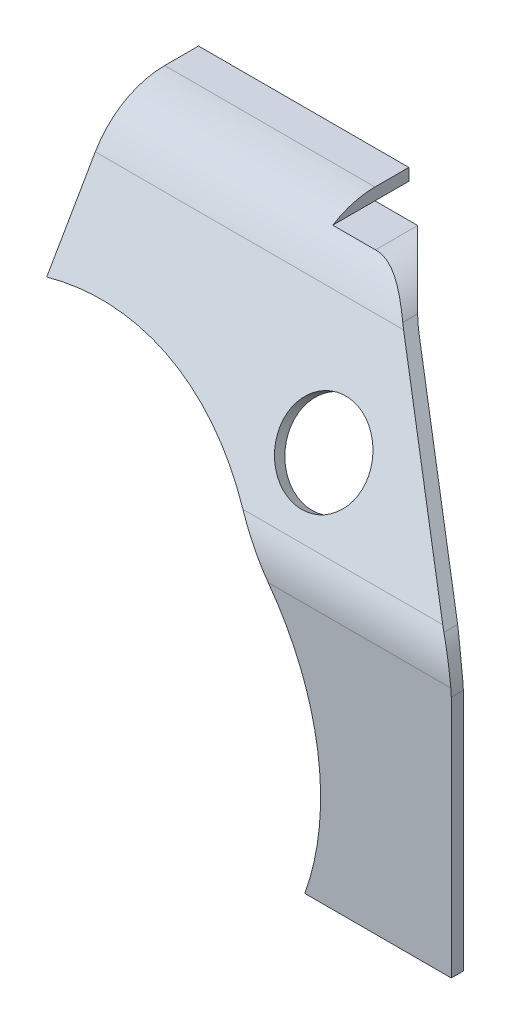
ISO-10303-21;
HEADER;
FILE_DESCRIPTION(('STEP AP214'),'2;1');
FILE_NAME('part.step','',(''),(''),'','','');
FILE_SCHEMA(('AUTOMOTIVE_DESIGN { 1 0 10303 214 1 1 1 1 }'));
ENDSEC;
DATA;
#1=APPLICATION_CONTEXT('core data for automotive mechanical design processes');
#2=APPLICATION_PROTOCOL_DEFINITION('international standard','automotive_design',2000,#1);
#3=PRODUCT_CONTEXT('',#1,'mechanical');
#4=PRODUCT('Part','Part','',(#3));
#5=PRODUCT_RELATED_PRODUCT_CATEGORY('part','',(#4));
#6=PRODUCT_DEFINITION_FORMATION('','',#4);
#7=PRODUCT_DEFINITION_CONTEXT('part definition',#1,'design');
#8=PRODUCT_DEFINITION('design','',#6,#7);
#9=PRODUCT_DEFINITION_SHAPE('','',#8);
#10=(LENGTH_UNIT() NAMED_UNIT(*) SI_UNIT(.MILLI.,.METRE.));
#11=(NAMED_UNIT(*) PLANE_ANGLE_UNIT() SI_UNIT($,.RADIAN.));
#12=(NAMED_UNIT(*) SI_UNIT($,.STERADIAN.) SOLID_ANGLE_UNIT());
#13=UNCERTAINTY_MEASURE_WITH_UNIT(LENGTH_MEASURE(1.E-05),#10,'distance_accuracy_value','');
#14=(GEOMETRIC_REPRESENTATION_CONTEXT(3) GLOBAL_UNCERTAINTY_ASSIGNED_CONTEXT((#13)) GLOBAL_UNIT_ASSIGNED_CONTEXT((#10,
#11,#12)) REPRESENTATION_CONTEXT('',''));
#15=CARTESIAN_POINT('',(0.,0.,0.));
#16=DIRECTION('',(0.,0.,1.));
#17=DIRECTION('',(1.,0.,0.));
#18=AXIS2_PLACEMENT_3D('',#15,#16,#17);
#19=CARTESIAN_POINT('',(58.05,68.,3.));
#20=DIRECTION('',(0.,0.,-1.));
#21=DIRECTION('',(0.,1.,0.));
#22=AXIS2_PLACEMENT_3D('',#19,#20,#21);
#23=PLANE('',#22);
#24=CARTESIAN_POINT('',(-45.0719206905526,22.7215242270665,2.99999999999999));
#25=DIRECTION('',(0.,0.,1.));
#26=DIRECTION('',(1.,0.,0.));
#27=AXIS2_PLACEMENT_3D('',#24,#25,#26);
#28=CIRCLE('',#27,67.5);
#29=CARTESIAN_POINT('',(18.4889346907183,0.,2.99999999999999));
#30=VERTEX_POINT('',#29);
#31=CARTESIAN_POINT('',(9.35862371702119,62.6410161513776,2.99999999999999));
#32=VERTEX_POINT('',#31);
#33=EDGE_CURVE('E169',#30,#32,#28,.T.);
#34=ORIENTED_EDGE('',*,*,#33,.F.);
#35=DIRECTION('',(-1.,0.,0.));
#36=VECTOR('',#35,1.);
#37=CARTESIAN_POINT('',(58.05,0.,2.99999999999999));
#38=LINE('',#37,#36);
#39=CARTESIAN_POINT('',(55.050895814341,4.6493348638715E-13,2.99999999999999));
#40=VERTEX_POINT('',#39);
#41=EDGE_CURVE('E213',#40,#30,#38,.T.);
#42=ORIENTED_EDGE('',*,*,#41,.F.);
#43=DIRECTION('',(0.,1.,0.));
#44=VECTOR('',#43,1.);
#45=CARTESIAN_POINT('',(55.050895814341,4.6493348638715E-13,2.99999999999999));
#46=LINE('',#45,#44);
#47=CARTESIAN_POINT('',(55.0508958143407,60.7205953146764,2.99999999999993));
#48=VERTEX_POINT('',#47);
#49=EDGE_CURVE('E422',#40,#48,#46,.T.);
#50=ORIENTED_EDGE('',*,*,#49,.T.);
#51=CARTESIAN_POINT('',(38.0508958143407,60.7205953146763,2.99999999999993));
#52=DIRECTION('',(0.,0.,-1.));
#53=DIRECTION('',(-1.,0.,0.));
#54=AXIS2_PLACEMENT_3D('',#51,#52,#53);
#55=CIRCLE('',#54,17.);
#56=CARTESIAN_POINT('',(54.9420764660881,62.6410161513776,2.99999999999993));
#57=VERTEX_POINT('',#56);
#58=EDGE_CURVE('E194',#57,#48,#55,.T.);
#59=ORIENTED_EDGE('',*,*,#58,.F.);
#60=DIRECTION('',(-1.,0.,0.));
#61=VECTOR('',#60,1.);
#62=CARTESIAN_POINT('',(58.05,62.6410161513776,3.));
#63=LINE('',#62,#61);
#64=EDGE_CURVE('E187',#57,#32,#63,.T.);
#65=ORIENTED_EDGE('',*,*,#64,.T.);
#66=EDGE_LOOP('',(#34,#42,#50,#59,#65));
#67=FACE_BOUND('',#66,.T.);
#68=ADVANCED_FACE('F46',(#67),#23,.F.);
#69=CARTESIAN_POINT('',(-58.05,0.,0.));
#70=DIRECTION('',(1.,0.,0.));
#71=DIRECTION('',(0.,0.,-1.));
#72=AXIS2_PLACEMENT_3D('',#69,#70,#71);
#73=PLANE('',#72);
#74=DIRECTION('',(0.,0.86602540378444,-0.499999999999998));
#75=VECTOR('',#74,1.);
#76=CARTESIAN_POINT('',(-58.05,67.1961524227066,0.));
#77=LINE('',#76,#75);
#78=CARTESIAN_POINT('',(-58.05,88.962142109433,-12.56660000481));
#79=VERTEX_POINT('',#78);
#80=CARTESIAN_POINT('',(-58.05,108.461524227066,-23.8245735194569));
#81=VERTEX_POINT('',#80);
#82=EDGE_CURVE('E333',#79,#81,#77,.T.);
#83=ORIENTED_EDGE('',*,*,#82,.F.);
#84=DIRECTION('',(0.,0.,1.));
#85=VECTOR('',#84,1.);
#86=CARTESIAN_POINT('',(-58.05,88.962142109433,-46.9999999999999));
#87=LINE('',#86,#85);
#88=CARTESIAN_POINT('',(-58.05,88.962142109433,-9.10249838967224));
#89=VERTEX_POINT('',#88);
#90=EDGE_CURVE('E319',#79,#89,#87,.T.);
#91=ORIENTED_EDGE('',*,*,#90,.T.);
#92=DIRECTION('',(0.,-0.86602540378444,0.499999999999998));
#93=VECTOR('',#92,1.);
#94=CARTESIAN_POINT('',(-58.05,119.961524227066,-26.9999999999999));
#95=LINE('',#94,#93);
#96=CARTESIAN_POINT('',(-58.05,109.961524227066,-21.2264973081036));
#97=VERTEX_POINT('',#96);
#98=EDGE_CURVE('E327',#97,#89,#95,.T.);
#99=ORIENTED_EDGE('',*,*,#98,.F.);
#100=CARTESIAN_POINT('',(-58.05,99.9615242270664,-38.5470053837924));
#101=DIRECTION('',(1.,0.,0.));
#102=DIRECTION('',(0.,0.,-1.));
#103=AXIS2_PLACEMENT_3D('',#100,#101,#102);
#104=CIRCLE('',#103,20.);
#105=CARTESIAN_POINT('',(-58.05,119.961524227066,-38.5470053837924));
#106=VERTEX_POINT('',#105);
#107=EDGE_CURVE('E371',#97,#106,#104,.F.);
#108=ORIENTED_EDGE('',*,*,#107,.T.);
#109=DIRECTION('',(0.,0.,1.));
#110=VECTOR('',#109,1.);
#111=CARTESIAN_POINT('',(-58.05,119.961524227066,-46.9999999999999));
#112=LINE('',#111,#110);
#113=CARTESIAN_POINT('',(-58.05,119.961524227066,-46.9999999999999));
#114=VERTEX_POINT('',#113);
#115=EDGE_CURVE('E356',#114,#106,#112,.T.);
#116=ORIENTED_EDGE('',*,*,#115,.F.);
#117=DIRECTION('',(0.,1.,0.));
#118=VECTOR('',#117,1.);
#119=CARTESIAN_POINT('',(-58.05,116.961524227066,-46.9999999999999));
#120=LINE('',#119,#118);
#121=CARTESIAN_POINT('',(-58.05,116.961524227066,-46.9999999999999));
#122=VERTEX_POINT('',#121);
#123=EDGE_CURVE('E347',#122,#114,#120,.T.);
#124=ORIENTED_EDGE('',*,*,#123,.F.);
#125=DIRECTION('',(0.,0.,-1.));
#126=VECTOR('',#125,1.);
#127=CARTESIAN_POINT('',(-58.05,116.961524227066,-28.7320508075687));
#128=LINE('',#127,#126);
#129=CARTESIAN_POINT('',(-58.05,116.961524227066,-38.5470053837924));
#130=VERTEX_POINT('',#129);
#131=EDGE_CURVE('E341',#130,#122,#128,.T.);
#132=ORIENTED_EDGE('',*,*,#131,.F.);
#133=CARTESIAN_POINT('',(-58.05,99.9615242270664,-38.5470053837924));
#134=DIRECTION('',(1.,0.,0.));
#135=DIRECTION('',(0.,0.,-1.));
#136=AXIS2_PLACEMENT_3D('',#133,#134,#135);
#137=CIRCLE('',#136,17.);
#138=EDGE_CURVE('E338',#130,#81,#137,.T.);
#139=ORIENTED_EDGE('',*,*,#138,.T.);
#140=EDGE_LOOP('',(#83,#91,#99,#108,#116,#124,#132,#139));
#141=FACE_BOUND('',#140,.T.);
#142=ADVANCED_FACE('F258',(#141),#73,.F.);
#143=CARTESIAN_POINT('',(58.05,99.9615242270664,-38.5470053837924));
#144=DIRECTION('',(1.,0.,0.));
#145=DIRECTION('',(0.,0.,-1.));
#146=AXIS2_PLACEMENT_3D('',#143,#144,#145);
#147=CYLINDRICAL_SURFACE('',#146,17.);
#148=CARTESIAN_POINT('',(27.3157707555489,99.9615242270664,-38.5470053837924));
#149=DIRECTION('',(0.766044443118976,0.642787609686541,0.));
#150=DIRECTION('',(0.642787609686542,-0.766044443118976,0.));
#151=AXIS2_PLACEMENT_3D('',#148,#149,#150);
#152=ELLIPSE('',#151,22.1919239186488,17.);
#153=CARTESIAN_POINT('',(20.183423890542,108.461524227066,-23.8245735194569));
#154=VERTEX_POINT('',#153);
#155=CARTESIAN_POINT('',(18.1466023699226,110.888913591738,-25.5242498507698));
#156=VERTEX_POINT('',#155);
#157=EDGE_CURVE('E209',#154,#156,#152,.F.);
#158=ORIENTED_EDGE('',*,*,#157,.F.);
#159=DIRECTION('',(-1.,0.,0.));
#160=VECTOR('',#159,1.);
#161=CARTESIAN_POINT('',(58.05,108.461524227066,-23.8245735194569));
#162=LINE('',#161,#160);
#163=EDGE_CURVE('E385',#81,#154,#162,.F.);
#164=ORIENTED_EDGE('',*,*,#163,.F.);
#165=ORIENTED_EDGE('',*,*,#138,.F.);
#166=DIRECTION('',(-1.,0.,0.));
#167=VECTOR('',#166,1.);
#168=CARTESIAN_POINT('',(-58.05,116.961524227066,-38.5470053837924));
#169=LINE('',#168,#167);
#170=CARTESIAN_POINT('',(-5.55000000000004,116.961524227067,-38.5470053837925));
#171=VERTEX_POINT('',#170);
#172=EDGE_CURVE('E377',#171,#130,#169,.T.);
#173=ORIENTED_EDGE('',*,*,#172,.F.);
#174=CARTESIAN_POINT('',(5.12384683689994,116.961524227067,-38.5470053837924));
#175=VERTEX_POINT('',#174);
#176=EDGE_CURVE('E382',#175,#171,#169,.T.);
#177=ORIENTED_EDGE('',*,*,#176,.F.);
#178=CARTESIAN_POINT('',(5.12384683690001,99.9615242270665,-38.5470053837924));
#179=DIRECTION('',(0.707106781186548,0.,-0.707106781186547));
#180=DIRECTION('',(0.707106781186548,0.,0.707106781186547));
#181=AXIS2_PLACEMENT_3D('',#178,#179,#180);
#182=ELLIPSE('',#181,24.0416305603426,17.);
#183=EDGE_CURVE('E230',#156,#175,#182,.F.);
#184=ORIENTED_EDGE('',*,*,#183,.F.);
#185=EDGE_LOOP('',(#158,#164,#165,#173,#177,#184));
#186=FACE_BOUND('',#185,.T.);
#187=ADVANCED_FACE('F411',(#186),#147,.F.);
#188=CARTESIAN_POINT('',(58.05,62.6410161513776,-17.));
#189=DIRECTION('',(1.,0.,0.));
#190=DIRECTION('',(0.,0.,-1.));
#191=AXIS2_PLACEMENT_3D('',#188,#189,#190);
#192=CYLINDRICAL_SURFACE('',#191,17.);
#193=DIRECTION('',(-1.,0.,0.));
#194=VECTOR('',#193,1.);
#195=CARTESIAN_POINT('',(58.05,62.6410161513776,0.));
#196=LINE('',#195,#194);
#197=CARTESIAN_POINT('',(9.35862371702118,62.6410161513776,0.));
#198=VERTEX_POINT('',#197);
#199=CARTESIAN_POINT('',(54.9420764660881,62.6410161513776,0.));
#200=VERTEX_POINT('',#199);
#201=EDGE_CURVE('E51',#198,#200,#196,.F.);
#202=ORIENTED_EDGE('',*,*,#201,.F.);
#203=CARTESIAN_POINT('',(9.35862371702118,62.6410161513776,0.));
#204=CARTESIAN_POINT('',(9.14366444772332,62.9341211886953,-5.1426327152452E-06));
#205=CARTESIAN_POINT('',(8.92636797796525,63.2254345498958,-0.00758021528181495));
#206=CARTESIAN_POINT('',(8.4874977596297,63.8040076190606,-0.0373530236044078));
#207=CARTESIAN_POINT('',(8.26592458599367,64.0912678630434,-0.0595488068419231));
#208=CARTESIAN_POINT('',(7.59556501501332,64.9460404950894,-0.147259891062621));
#209=CARTESIAN_POINT('',(7.1408813778368,65.506895296019,-0.233900173430174));
#210=CARTESIAN_POINT('',(6.22625738618625,66.5991619498439,-0.457951427369915));
#211=CARTESIAN_POINT('',(5.76649764752407,67.1308888942026,-0.594582867108043));
#212=CARTESIAN_POINT('',(4.83823721746269,68.1716297591137,-0.915574821227867));
#213=CARTESIAN_POINT('',(4.36973847381397,68.6806486570504,-1.09992481530274));
#214=CARTESIAN_POINT('',(3.57780609212094,69.5154473088458,-1.4476268825233));
#215=CARTESIAN_POINT('',(3.25587725848414,69.8477848327219,-1.59885133676382));
#216=CARTESIAN_POINT('',(2.60871143359641,70.5024886542673,-1.92249861588798));
#217=CARTESIAN_POINT('',(2.28346594497334,70.824794084813,-2.09502762753208));
#218=CARTESIAN_POINT('',(1.95788689773735,71.1410161513775,-2.27756813566452));
#219=B_SPLINE_CURVE_WITH_KNOTS('',3,(#203,#204,#205,#206,#207,#208,#209,#210,#211,#212,#213,
#214,#215,#216,#217,#218),.UNSPECIFIED.,.F.,.F.,(4,2,2,2,2,2,2,4),(0.,1.09023800501283,
2.18033045017189,4.35921538197208,6.50547920317344,8.65127024913212,10.111083053848,
11.578490183521),.UNSPECIFIED.);
#220=CARTESIAN_POINT('',(1.95788689773736,71.1410161513775,-2.27756813566452));
#221=VERTEX_POINT('',#220);
#222=EDGE_CURVE('E306',#198,#221,#219,.T.);
#223=ORIENTED_EDGE('',*,*,#222,.T.);
#224=DIRECTION('',(-1.,0.,0.));
#225=VECTOR('',#224,1.);
#226=CARTESIAN_POINT('',(-58.05,71.1410161513775,-2.27756813566452));
#227=LINE('',#226,#225);
#228=CARTESIAN_POINT('',(51.48275456829,71.1410161513775,-2.27756813566452));
#229=VERTEX_POINT('',#228);
#230=EDGE_CURVE('E214',#229,#221,#227,.T.);
#231=ORIENTED_EDGE('',*,*,#230,.F.);
#232=CARTESIAN_POINT('',(54.9420764660881,62.6410161513776,0.));
#233=CARTESIAN_POINT('',(54.919334039781,62.8410778656383,3.2817420601101E-06));
#234=CARTESIAN_POINT('',(54.8930337510738,63.0406983104257,-0.00353262128909872));
#235=CARTESIAN_POINT('',(54.8334099589753,63.4386241561322,-0.0175548554111924));
#236=CARTESIAN_POINT('',(54.8000870973747,63.636929675515,-0.0280405515504063));
#237=CARTESIAN_POINT('',(54.6898120040309,64.2287656530385,-0.0696952404371726));
#238=CARTESIAN_POINT('',(54.6024935376012,64.6197387489288,-0.111062512932444));
#239=CARTESIAN_POINT('',(54.4043904150723,65.3803662258865,-0.217883145646493));
#240=CARTESIAN_POINT('',(54.2943273265755,65.7503110806001,-0.282633335977358));
#241=CARTESIAN_POINT('',(54.0509536470642,66.477788043186,-0.434455797684508));
#242=CARTESIAN_POINT('',(53.9176400979125,66.8353185646439,-0.521530910106089));
#243=CARTESIAN_POINT('',(53.6259381803424,67.5447338879187,-0.71833913042674));
#244=CARTESIAN_POINT('',(53.4670023830039,67.8962491097505,-0.828588125593772));
#245=CARTESIAN_POINT('',(53.1285324397764,68.5826150776642,-1.06797038015978));
#246=CARTESIAN_POINT('',(52.9489921310169,68.9174607946847,-1.19710929277729));
#247=CARTESIAN_POINT('',(52.5656308145079,69.5790950473408,-1.47596172577744));
#248=CARTESIAN_POINT('',(52.3612441010256,69.9053428539206,-1.62617518769987));
#249=CARTESIAN_POINT('',(51.9348056802218,70.5380531029711,-1.9413906006558));
#250=CARTESIAN_POINT('',(51.7127719837323,70.8445351542651,-2.10637749489704));
#251=CARTESIAN_POINT('',(51.48275456829,71.1410161513775,-2.27756813566452));
#252=B_SPLINE_CURVE_WITH_KNOTS('',3,(#232,#233,#234,#235,#236,#237,#238,#239,#240,#241,#242,
#243,#244,#245,#246,#247,#248,#249,#250,#251),.UNSPECIFIED.,.F.,.F.,(4,2,2,2,2,2,2,2,2,4),(0.,
0.603917425499734,1.20777968308954,2.41393127787172,3.58647843572826,4.75917488478916,
5.96143624875911,7.16405815452329,8.40265831934522,9.64001019115751),.UNSPECIFIED.);
#253=EDGE_CURVE('E232',#200,#229,#252,.T.);
#254=ORIENTED_EDGE('',*,*,#253,.F.);
#255=EDGE_LOOP('',(#202,#223,#231,#254));
#256=FACE_BOUND('',#255,.T.);
#257=ADVANCED_FACE('F48',(#256),#192,.F.);
#258=CARTESIAN_POINT('',(58.05,67.1961524227066,0.));
#259=DIRECTION('',(0.,0.499999999999998,0.86602540378444));
#260=DIRECTION('',(0.,-0.86602540378444,0.499999999999998));
#261=AXIS2_PLACEMENT_3D('',#258,#259,#260);
#262=PLANE('',#261);
#263=CARTESIAN_POINT('',(12.3508958143472,85.3015401945494,-10.4531505038559));
#264=DIRECTION('',(0.,0.499999999999998,0.86602540378444));
#265=DIRECTION('',(0.,-0.86602540378444,0.499999999999998));
#266=AXIS2_PLACEMENT_3D('',#263,#264,#265);
#267=CIRCLE('',#266,11.);
#268=CARTESIAN_POINT('',(12.3508958143472,75.7752607529205,-4.95315050385592));
#269=VERTEX_POINT('',#268);
#270=EDGE_CURVE('E177',#269,#269,#267,.T.);
#271=ORIENTED_EDGE('',*,*,#270,.T.);
#272=EDGE_LOOP('',(#271));
#273=FACE_BOUND('',#272,.T.);
#274=ORIENTED_EDGE('',*,*,#230,.T.);
#275=CARTESIAN_POINT('',(-45.0719206905526,22.7215242270665,25.6774385608612));
#276=DIRECTION('',(0.,0.499999999999998,0.86602540378444));
#277=DIRECTION('',(0.,-0.86602540378444,0.499999999999998));
#278=AXIS2_PLACEMENT_3D('',#275,#276,#277);
#279=ELLIPSE('',#278,77.9422863405994,67.5);
#280=EDGE_CURVE('E314',#221,#79,#279,.T.);
#281=ORIENTED_EDGE('',*,*,#280,.T.);
#282=ORIENTED_EDGE('',*,*,#82,.T.);
#283=ORIENTED_EDGE('',*,*,#163,.T.);
#284=DIRECTION('',(-0.587858883152558,0.700582935935476,-0.404481746652003));
#285=VECTOR('',#284,1.);
#286=CARTESIAN_POINT('',(55.9291377177779,65.8614413536138,0.770595795031102));
#287=LINE('',#286,#285);
#288=CARTESIAN_POINT('',(51.0736513473633,71.6479846793475,-2.5702665517587));
#289=VERTEX_POINT('',#288);
#290=EDGE_CURVE('E613',#289,#154,#287,.T.);
#291=ORIENTED_EDGE('',*,*,#290,.F.);
#292=CARTESIAN_POINT('',(38.0508958143407,60.7205953146763,3.73866463947403));
#293=DIRECTION('',(0.,0.499999999999998,0.86602540378444));
#294=DIRECTION('',(0.,0.86602540378444,-0.499999999999998));
#295=AXIS2_PLACEMENT_3D('',#292,#293,#294);
#296=ELLIPSE('',#295,19.6299091524472,17.);
#297=EDGE_CURVE('E445',#229,#289,#296,.T.);
#298=ORIENTED_EDGE('',*,*,#297,.F.);
#299=EDGE_LOOP('',(#274,#281,#282,#283,#291,#298));
#300=FACE_BOUND('',#299,.T.);
#301=ADVANCED_FACE('F335',(#273,#300),#262,.F.);
#302=CARTESIAN_POINT('',(58.05,0.,0.));
#303=DIRECTION('',(0.,0.,1.));
#304=DIRECTION('',(1.,0.,0.));
#305=AXIS2_PLACEMENT_3D('',#302,#303,#304);
#306=PLANE('',#305);
#307=DIRECTION('',(-1.,0.,0.));
#308=VECTOR('',#307,1.);
#309=CARTESIAN_POINT('',(58.05,0.,0.));
#310=LINE('',#309,#308);
#311=CARTESIAN_POINT('',(55.050895814341,4.62041946253422E-13,0.));
#312=VERTEX_POINT('',#311);
#313=CARTESIAN_POINT('',(18.4889346907183,0.,0.));
#314=VERTEX_POINT('',#313);
#315=EDGE_CURVE('E200',#312,#314,#310,.T.);
#316=ORIENTED_EDGE('',*,*,#315,.T.);
#317=CARTESIAN_POINT('',(-45.0719206905526,22.7215242270665,0.));
#318=DIRECTION('',(0.,0.,1.));
#319=DIRECTION('',(1.,0.,0.));
#320=AXIS2_PLACEMENT_3D('',#317,#318,#319);
#321=CIRCLE('',#320,67.5);
#322=EDGE_CURVE('E64',#314,#198,#321,.T.);
#323=ORIENTED_EDGE('',*,*,#322,.T.);
#324=ORIENTED_EDGE('',*,*,#201,.T.);
#325=CARTESIAN_POINT('',(38.0508958143407,60.7205953146763,0.));
#326=DIRECTION('',(0.,0.,1.));
#327=DIRECTION('',(1.,0.,0.));
#328=AXIS2_PLACEMENT_3D('',#325,#326,#327);
#329=CIRCLE('',#328,17.);
#330=CARTESIAN_POINT('',(55.0508958143407,60.7205953146764,0.));
#331=VERTEX_POINT('',#330);
#332=EDGE_CURVE('E269',#331,#200,#329,.T.);
#333=ORIENTED_EDGE('',*,*,#332,.F.);
#334=DIRECTION('',(0.,1.,0.));
#335=VECTOR('',#334,1.);
#336=CARTESIAN_POINT('',(55.050895814341,0.,0.));
#337=LINE('',#336,#335);
#338=EDGE_CURVE('E59',#312,#331,#337,.T.);
#339=ORIENTED_EDGE('',*,*,#338,.F.);
#340=EDGE_LOOP('',(#316,#323,#324,#333,#339));
#341=FACE_BOUND('',#340,.T.);
#342=ADVANCED_FACE('F449',(#341),#306,.F.);
#343=CARTESIAN_POINT('',(58.05,99.9615242270664,-38.5470053837924));
#344=DIRECTION('',(-1.,0.,0.));
#345=DIRECTION('',(0.,0.,1.));
#346=AXIS2_PLACEMENT_3D('',#343,#344,#345);
#347=CYLINDRICAL_SURFACE('',#346,20.);
#348=DIRECTION('',(-1.,0.,0.));
#349=VECTOR('',#348,1.);
#350=CARTESIAN_POINT('',(58.0499999999999,116.961524227067,-28.0113516309404));
#351=LINE('',#350,#349);
#352=CARTESIAN_POINT('',(5.12384683689994,116.961524227067,-28.01135163094));
#353=VERTEX_POINT('',#352);
#354=CARTESIAN_POINT('',(-5.55000000000004,116.961524227067,-28.0113516309404));
#355=VERTEX_POINT('',#354);
#356=EDGE_CURVE('E611',#353,#355,#351,.T.);
#357=ORIENTED_EDGE('',*,*,#356,.T.);
#358=CARTESIAN_POINT('',(-5.55000000000001,99.9615242270664,-38.5470053837924));
#359=DIRECTION('',(1.,0.,0.));
#360=DIRECTION('',(0.,1.,0.));
#361=AXIS2_PLACEMENT_3D('',#358,#359,#360);
#362=CIRCLE('',#361,20.);
#363=CARTESIAN_POINT('',(-5.55000000000005,119.961524227067,-38.5470053837925));
#364=VERTEX_POINT('',#363);
#365=EDGE_CURVE('E351',#355,#364,#362,.F.);
#366=ORIENTED_EDGE('',*,*,#365,.T.);
#367=DIRECTION('',(-1.,0.,0.));
#368=VECTOR('',#367,1.);
#369=CARTESIAN_POINT('',(58.05,119.961524227066,-38.5470053837924));
#370=LINE('',#369,#368);
#371=EDGE_CURVE('E372',#106,#364,#370,.F.);
#372=ORIENTED_EDGE('',*,*,#371,.F.);
#373=ORIENTED_EDGE('',*,*,#107,.F.);
#374=DIRECTION('',(-1.,0.,0.));
#375=VECTOR('',#374,1.);
#376=CARTESIAN_POINT('',(58.05,109.961524227066,-21.2264973081036));
#377=LINE('',#376,#375);
#378=CARTESIAN_POINT('',(18.9247744437761,109.961524227066,-21.2264973081036));
#379=VERTEX_POINT('',#378);
#380=EDGE_CURVE('E201',#379,#97,#377,.T.);
#381=ORIENTED_EDGE('',*,*,#380,.F.);
#382=CARTESIAN_POINT('',(27.3157707555489,99.9615242270664,-38.5470053837924));
#383=DIRECTION('',(0.766044443118976,0.642787609686541,0.));
#384=DIRECTION('',(-0.642787609686542,0.766044443118976,0.));
#385=AXIS2_PLACEMENT_3D('',#382,#383,#384);
#386=ELLIPSE('',#385,26.1081457866456,20.);
#387=CARTESIAN_POINT('',(18.1466023699226,110.888913591738,-21.7961199841227));
#388=VERTEX_POINT('',#387);
#389=EDGE_CURVE('E617',#379,#388,#386,.F.);
#390=ORIENTED_EDGE('',*,*,#389,.T.);
#391=CARTESIAN_POINT('',(18.1466023699226,110.888913591738,-21.7961199841227));
#392=CARTESIAN_POINT('',(17.9736740642455,111.094989527595,-21.9305500909028));
#393=CARTESIAN_POINT('',(17.7965874966077,111.296110651878,-22.0671746936423));
#394=CARTESIAN_POINT('',(17.4344589132233,111.688422707842,-22.3439978561944));
#395=CARTESIAN_POINT('',(17.2494181046327,111.879615136669,-22.4841958723911));
#396=CARTESIAN_POINT('',(16.8716588829598,112.252141856973,-22.7674150036981));
#397=CARTESIAN_POINT('',(16.6789392257137,112.433474539579,-22.9104365743847));
#398=CARTESIAN_POINT('',(16.2860899428549,112.786266742225,-23.1984595091002));
#399=CARTESIAN_POINT('',(16.0859598972168,112.957725701205,-23.3434609850565));
#400=CARTESIAN_POINT('',(15.4704888322729,113.460779957492,-23.7832085316473));
#401=CARTESIAN_POINT('',(15.0439346303349,113.77724324659,-24.0797689519091));
#402=CARTESIAN_POINT('',(14.1618324377933,114.369756970441,-24.6697794463797));
#403=CARTESIAN_POINT('',(13.7062931089616,114.645819397763,-24.9632304195052));
#404=CARTESIAN_POINT('',(12.9220975371303,115.071604165281,-25.4416159918227));
#405=CARTESIAN_POINT('',(12.6017819408408,115.232759890446,-25.6301074294754));
#406=CARTESIAN_POINT('',(11.947188763367,115.536252243159,-25.9977193918585));
#407=CARTESIAN_POINT('',(11.6129144336623,115.678593221501,-26.1768420772443));
#408=CARTESIAN_POINT('',(10.9305439493834,115.943259169989,-26.5207380242421));
#409=CARTESIAN_POINT('',(10.5824860598767,116.065635304538,-26.6855474426583));
#410=CARTESIAN_POINT('',(9.87122832346907,116.289451959786,-26.9955852725739));
#411=CARTESIAN_POINT('',(9.5080349945082,116.390901382654,-27.1408220010907));
#412=CARTESIAN_POINT('',(8.87438224344016,116.544850276085,-27.366388601932));
#413=CARTESIAN_POINT('',(8.6076451995288,116.603007384816,-27.4533154409466));
#414=CARTESIAN_POINT('',(8.06712741172895,116.707054358501,-27.6110030083618));
#415=CARTESIAN_POINT('',(7.79334937825444,116.752948868665,-27.6817698568698));
#416=CARTESIAN_POINT('',(7.24057304704835,116.831531746706,-27.8041872092607));
#417=CARTESIAN_POINT('',(6.96159398248098,116.864261393824,-27.8558974229831));
#418=CARTESIAN_POINT('',(6.39936340454048,116.915951578616,-27.938056755063));
#419=CARTESIAN_POINT('',(6.11611513863519,116.934922091385,-27.9685212755008));
#420=CARTESIAN_POINT('',(5.71414030469924,116.951682590626,-27.9954850388911));
#421=CARTESIAN_POINT('',(5.59621815184949,116.955370293818,-28.0014270793895));
#422=CARTESIAN_POINT('',(5.36015200078204,116.960291735124,-28.0093623415647));
#423=CARTESIAN_POINT('',(5.24200794324855,116.961524680854,-28.0113542881724));
#424=CARTESIAN_POINT('',(5.12384683689994,116.961524227067,-28.01135163094));
#425=B_SPLINE_CURVE_WITH_KNOTS('',3,(#391,#392,#393,#394,#395,#396,#397,#398,#399,#400,#401,
#402,#403,#404,#405,#406,#407,#408,#409,#410,#411,#412,#413,#414,#415,#416,#417,#418,#419,#420,
#421,#422,#423,#424),.UNSPECIFIED.,.F.,.F.,(4,2,2,2,2,2,2,2,2,2,2,2,2,2,2,2,4),(0.,
0.902099599215328,1.80406277349489,2.70617268720868,3.60833381158176,5.43110430316136,
7.25333262228913,8.46795030381837,9.68228661941015,10.8934603052038,12.1041176935055,
12.962960392017,13.8214772884059,14.677280864882,15.5324633791995,15.8867756345305,
16.2412022413565),.UNSPECIFIED.);
#426=EDGE_CURVE('E268',#388,#353,#425,.T.);
#427=ORIENTED_EDGE('',*,*,#426,.T.);
#428=EDGE_LOOP('',(#357,#366,#372,#373,#381,#390,#427));
#429=FACE_BOUND('',#428,.T.);
#430=ADVANCED_FACE('F285',(#429),#347,.T.);
#431=CARTESIAN_POINT('',(58.05,62.6410161513776,-17.));
#432=DIRECTION('',(-1.,0.,0.));
#433=DIRECTION('',(0.,0.,1.));
#434=AXIS2_PLACEMENT_3D('',#431,#432,#433);
#435=CYLINDRICAL_SURFACE('',#434,20.);
#436=CARTESIAN_POINT('',(9.35862371702118,62.6410161513776,3.00000000000001));
#437=CARTESIAN_POINT('',(9.10562241830296,62.9860005682905,2.9999969489804));
#438=CARTESIAN_POINT('',(8.84934771577075,63.3285412451369,2.99107435696233));
#439=CARTESIAN_POINT('',(8.33080921015934,64.0080929620835,2.95612342978168));
#440=CARTESIAN_POINT('',(8.06854636856229,64.3451048751793,2.93009782236924));
#441=CARTESIAN_POINT('',(7.53868152454433,65.0128489733035,2.86169610057477));
#442=CARTESIAN_POINT('',(7.27108312443892,65.3435851194129,2.81933068574126));
#443=CARTESIAN_POINT('',(6.73089290081375,65.9985245447582,2.71894775901359));
#444=CARTESIAN_POINT('',(6.45830090251183,66.3227275944904,2.66092969827788));
#445=CARTESIAN_POINT('',(5.64195527510179,67.2753657372623,2.46634988404107));
#446=CARTESIAN_POINT('',(5.09163565924787,67.8938897482178,2.30818716798501));
#447=CARTESIAN_POINT('',(3.97722316051955,69.1015487283768,1.93833052903393));
#448=CARTESIAN_POINT('',(3.41313207009018,69.690687492202,1.72664353945789));
#449=CARTESIAN_POINT('',(2.63996854794953,70.4699236141576,1.40537004850006));
#450=CARTESIAN_POINT('',(2.43529484432324,70.6735553923791,1.31740328291936));
#451=CARTESIAN_POINT('',(2.02481832942915,71.0767709933934,1.13524120273557));
#452=CARTESIAN_POINT('',(1.81901578725378,71.2763557318215,1.04104731802453));
#453=CARTESIAN_POINT('',(1.40528449990361,71.6725393360573,0.846025027677918));
#454=CARTESIAN_POINT('',(1.19735027858948,71.8691160538014,0.745163319431745));
#455=CARTESIAN_POINT('',(0.780586950696529,72.2581657188985,0.53736170937104));
#456=CARTESIAN_POINT('',(0.571757662925148,72.450637783148,0.430420517359256));
#457=CARTESIAN_POINT('',(0.362585205502233,72.6410161513776,0.320508075688794));
#458=B_SPLINE_CURVE_WITH_KNOTS('',3,(#436,#437,#438,#439,#440,#441,#442,#443,#444,#445,#446,
#447,#448,#449,#450,#451,#452,#453,#454,#455,#456,#457),.UNSPECIFIED.,.F.,.F.,(4,2,2,2,2,2,2,2,
2,2,4),(0.,1.28327455476697,2.56634449046536,3.84857567545612,5.13085182621377,7.65683124796462,
10.1824836319882,11.0878809474005,11.9930710797394,12.9031851806228,13.8134931536067),.UNSPECIFIED.);
#459=CARTESIAN_POINT('',(0.36258520550228,72.6410161513775,0.320508075688807));
#460=VERTEX_POINT('',#459);
#461=EDGE_CURVE('E175',#32,#460,#458,.T.);
#462=ORIENTED_EDGE('',*,*,#461,.F.);
#463=ORIENTED_EDGE('',*,*,#64,.F.);
#464=CARTESIAN_POINT('',(54.9420764660881,62.6410161513776,3.00000000000001));
#465=CARTESIAN_POINT('',(54.9179193115711,62.8535184775621,3.00000357667472));
#466=CARTESIAN_POINT('',(54.88974919203,63.0655267125537,2.99661216506532));
#467=CARTESIAN_POINT('',(54.8254760101798,63.4881078919754,2.98317057057549));
#468=CARTESIAN_POINT('',(54.7893735962435,63.6986809522647,2.97312093179239));
#469=CARTESIAN_POINT('',(54.6693975712071,64.3271201383131,2.9332129072196));
#470=CARTESIAN_POINT('',(54.5737961032313,64.7422239264023,2.89359476742513));
#471=CARTESIAN_POINT('',(54.3557856152048,65.5497479674667,2.79142291733916));
#472=CARTESIAN_POINT('',(54.2341964327263,65.9424780050369,2.72953798450623));
#473=CARTESIAN_POINT('',(53.9643539057238,66.7146869614384,2.58467596176691));
#474=CARTESIAN_POINT('',(53.8160975204955,67.094164363251,2.50169646612514));
#475=CARTESIAN_POINT('',(53.4910181106338,67.8462056093783,2.31475098770332));
#476=CARTESIAN_POINT('',(53.3136151827313,68.2184082416265,2.21034518681166));
#477=CARTESIAN_POINT('',(52.9347006366498,68.9449666902422,1.98433634559891));
#478=CARTESIAN_POINT('',(52.7331825095624,69.2993176514446,1.86272866071532));
#479=CARTESIAN_POINT('',(52.3016311872235,69.9990950984783,1.60113655054425));
#480=CARTESIAN_POINT('',(52.070927800551,70.3439420510013,1.46071289641742));
#481=CARTESIAN_POINT('',(51.5880040513745,71.0121681836267,1.16747322146916));
#482=CARTESIAN_POINT('',(51.3358029349835,71.3355661143958,1.01466829107653));
#483=CARTESIAN_POINT('',(51.0736513473634,71.6479846793475,0.857057930581926));
#484=B_SPLINE_CURVE_WITH_KNOTS('',3,(#464,#465,#466,#467,#468,#469,#470,#471,#472,#473,#474,
#475,#476,#477,#478,#479,#480,#481,#482,#483),.UNSPECIFIED.,.F.,.F.,(4,2,2,2,2,2,2,2,2,4),(0.,
0.641475359483341,1.2828983053158,2.56418783680745,3.80982948115353,5.05561324883393,
6.3301244412461,7.60498041485907,8.91778065941639,10.22941770481),.UNSPECIFIED.);
#485=CARTESIAN_POINT('',(51.0736513473633,71.6479846793475,0.857057930581918));
#486=VERTEX_POINT('',#485);
#487=EDGE_CURVE('E259',#57,#486,#484,.T.);
#488=ORIENTED_EDGE('',*,*,#487,.T.);
#489=CARTESIAN_POINT('',(58.6313953172083,62.6410161513776,-17.));
#490=DIRECTION('',(0.766044443118976,0.642787609686541,0.));
#491=DIRECTION('',(-0.642787609686542,0.766044443118976,0.));
#492=AXIS2_PLACEMENT_3D('',#489,#490,#491);
#493=ELLIPSE('',#492,26.1081457866456,20.);
#494=CARTESIAN_POINT('',(50.2403990054355,72.6410161513776,0.320508075688897));
#495=VERTEX_POINT('',#494);
#496=EDGE_CURVE('E625',#486,#495,#493,.F.);
#497=ORIENTED_EDGE('',*,*,#496,.T.);
#498=DIRECTION('',(-1.,0.,0.));
#499=VECTOR('',#498,1.);
#500=CARTESIAN_POINT('',(58.05,72.6410161513775,0.320508075688807));
#501=LINE('',#500,#499);
#502=EDGE_CURVE('E189',#460,#495,#501,.F.);
#503=ORIENTED_EDGE('',*,*,#502,.F.);
#504=EDGE_LOOP('',(#462,#463,#488,#497,#503));
#505=FACE_BOUND('',#504,.T.);
#506=ADVANCED_FACE('F183',(#505),#435,.T.);
#507=CARTESIAN_POINT('',(58.05,119.961524227066,-26.9999999999999));
#508=DIRECTION('',(0.,-0.499999999999998,-0.86602540378444));
#509=DIRECTION('',(0.,0.86602540378444,-0.499999999999998));
#510=AXIS2_PLACEMENT_3D('',#507,#508,#509);
#511=PLANE('',#510);
#512=CARTESIAN_POINT('',(12.3508958143472,86.8015401945494,-7.85507429250256));
#513=DIRECTION('',(0.,0.499999999999998,0.86602540378444));
#514=DIRECTION('',(0.,-0.86602540378444,0.499999999999998));
#515=AXIS2_PLACEMENT_3D('',#512,#513,#514);
#516=CIRCLE('',#515,11.);
#517=CARTESIAN_POINT('',(12.3508958143472,77.2752607529205,-2.35507429250259));
#518=VERTEX_POINT('',#517);
#519=EDGE_CURVE('E452',#518,#518,#516,.T.);
#520=ORIENTED_EDGE('',*,*,#519,.F.);
#521=EDGE_LOOP('',(#520));
#522=FACE_BOUND('',#521,.T.);
#523=ORIENTED_EDGE('',*,*,#98,.T.);
#524=CARTESIAN_POINT('',(-45.0719206905526,22.7215242270665,29.141540175999));
#525=DIRECTION('',(0.,-0.499999999999998,-0.86602540378444));
#526=DIRECTION('',(0.,-0.86602540378444,0.499999999999998));
#527=AXIS2_PLACEMENT_3D('',#524,#525,#526);
#528=ELLIPSE('',#527,77.9422863405994,67.5);
#529=EDGE_CURVE('E193',#89,#460,#528,.T.);
#530=ORIENTED_EDGE('',*,*,#529,.T.);
#531=ORIENTED_EDGE('',*,*,#502,.T.);
#532=DIRECTION('',(-0.587858883152557,0.700582935935476,-0.404481746652005));
#533=VECTOR('',#532,1.);
#534=CARTESIAN_POINT('',(-5.01910644354698,138.496730295181,-37.7013062129112));
#535=LINE('',#534,#533);
#536=EDGE_CURVE('E188',#495,#379,#535,.T.);
#537=ORIENTED_EDGE('',*,*,#536,.T.);
#538=ORIENTED_EDGE('',*,*,#380,.T.);
#539=EDGE_LOOP('',(#523,#530,#531,#537,#538));
#540=FACE_BOUND('',#539,.T.);
#541=ADVANCED_FACE('F281',(#522,#540),#511,.F.);
#542=CARTESIAN_POINT('',(58.05,116.961524227066,-46.9999999999999));
#543=DIRECTION('',(0.,0.,1.));
#544=DIRECTION('',(1.,0.,0.));
#545=AXIS2_PLACEMENT_3D('',#542,#543,#544);
#546=PLANE('',#545);
#547=DIRECTION('',(0.,1.,0.));
#548=VECTOR('',#547,1.);
#549=CARTESIAN_POINT('',(-5.55000000000003,116.961524227066,-46.9999999999999));
#550=LINE('',#549,#548);
#551=CARTESIAN_POINT('',(-5.55000000000004,116.961524227067,-46.9999999999999));
#552=VERTEX_POINT('',#551);
#553=CARTESIAN_POINT('',(-5.55000000000005,119.961524227067,-46.9999999999999));
#554=VERTEX_POINT('',#553);
#555=EDGE_CURVE('E342',#552,#554,#550,.T.);
#556=ORIENTED_EDGE('',*,*,#555,.F.);
#557=DIRECTION('',(-1.,0.,0.));
#558=VECTOR('',#557,1.);
#559=CARTESIAN_POINT('',(58.05,116.961524227066,-46.9999999999999));
#560=LINE('',#559,#558);
#561=EDGE_CURVE('E203',#552,#122,#560,.T.);
#562=ORIENTED_EDGE('',*,*,#561,.T.);
#563=ORIENTED_EDGE('',*,*,#123,.T.);
#564=DIRECTION('',(-1.,0.,0.));
#565=VECTOR('',#564,1.);
#566=CARTESIAN_POINT('',(58.05,119.961524227066,-46.9999999999999));
#567=LINE('',#566,#565);
#568=EDGE_CURVE('E364',#554,#114,#567,.T.);
#569=ORIENTED_EDGE('',*,*,#568,.F.);
#570=EDGE_LOOP('',(#556,#562,#563,#569));
#571=FACE_BOUND('',#570,.T.);
#572=ADVANCED_FACE('F416',(#571),#546,.F.);
#573=CARTESIAN_POINT('',(58.05,119.961524227066,-46.9999999999999));
#574=DIRECTION('',(0.,-1.,0.));
#575=DIRECTION('',(0.,0.,-1.));
#576=AXIS2_PLACEMENT_3D('',#573,#574,#575);
#577=PLANE('',#576);
#578=DIRECTION('',(0.,0.,1.));
#579=VECTOR('',#578,1.);
#580=CARTESIAN_POINT('',(-5.55000000000005,119.961524227066,-249.));
#581=LINE('',#580,#579);
#582=EDGE_CURVE('E404',#554,#364,#581,.T.);
#583=ORIENTED_EDGE('',*,*,#582,.F.);
#584=ORIENTED_EDGE('',*,*,#568,.T.);
#585=ORIENTED_EDGE('',*,*,#115,.T.);
#586=ORIENTED_EDGE('',*,*,#371,.T.);
#587=EDGE_LOOP('',(#583,#584,#585,#586));
#588=FACE_BOUND('',#587,.T.);
#589=ADVANCED_FACE('F418',(#588),#577,.F.);
#590=CARTESIAN_POINT('',(58.05,116.961524227066,-28.7320508075687));
#591=DIRECTION('',(0.,1.,0.));
#592=DIRECTION('',(0.,0.,1.));
#593=AXIS2_PLACEMENT_3D('',#590,#591,#592);
#594=PLANE('',#593);
#595=ORIENTED_EDGE('',*,*,#561,.F.);
#596=DIRECTION('',(0.,0.,1.));
#597=VECTOR('',#596,1.);
#598=CARTESIAN_POINT('',(-5.55000000000004,116.961524227066,-249.));
#599=LINE('',#598,#597);
#600=EDGE_CURVE('E399',#552,#171,#599,.T.);
#601=ORIENTED_EDGE('',*,*,#600,.T.);
#602=ORIENTED_EDGE('',*,*,#172,.T.);
#603=ORIENTED_EDGE('',*,*,#131,.T.);
#604=EDGE_LOOP('',(#595,#601,#602,#603));
#605=FACE_BOUND('',#604,.T.);
#606=ADVANCED_FACE('F406',(#605),#594,.F.);
#607=CARTESIAN_POINT('',(58.05,0.,2.99999999999999));
#608=DIRECTION('',(0.,1.,0.));
#609=DIRECTION('',(0.,0.,1.));
#610=AXIS2_PLACEMENT_3D('',#607,#608,#609);
#611=PLANE('',#610);
#612=ORIENTED_EDGE('',*,*,#41,.T.);
#613=DIRECTION('',(0.,0.,1.));
#614=VECTOR('',#613,1.);
#615=CARTESIAN_POINT('',(18.4889346907183,0.,-46.9999999999999));
#616=LINE('',#615,#614);
#617=EDGE_CURVE('E12',#30,#314,#616,.F.);
#618=ORIENTED_EDGE('',*,*,#617,.T.);
#619=ORIENTED_EDGE('',*,*,#315,.F.);
#620=DIRECTION('',(0.,0.,1.));
#621=VECTOR('',#620,1.);
#622=CARTESIAN_POINT('',(55.050895814341,2.22044115153978E-13,-249.));
#623=LINE('',#622,#621);
#624=EDGE_CURVE('E409',#312,#40,#623,.T.);
#625=ORIENTED_EDGE('',*,*,#624,.T.);
#626=EDGE_LOOP('',(#612,#618,#619,#625));
#627=FACE_BOUND('',#626,.T.);
#628=ADVANCED_FACE('F283',(#627),#611,.F.);
#629=CARTESIAN_POINT('',(5.12384683690002,99.9615242270664,-249.));
#630=DIRECTION('',(0.,0.,-1.));
#631=DIRECTION('',(-1.,0.,0.));
#632=AXIS2_PLACEMENT_3D('',#629,#630,#631);
#633=CYLINDRICAL_SURFACE('',#632,17.);
#634=DIRECTION('',(0.,0.,1.));
#635=VECTOR('',#634,1.);
#636=CARTESIAN_POINT('',(18.1466023699226,110.888913591738,-249.));
#637=LINE('',#636,#635);
#638=EDGE_CURVE('E431',#388,#156,#637,.F.);
#639=ORIENTED_EDGE('',*,*,#638,.T.);
#640=ORIENTED_EDGE('',*,*,#183,.T.);
#641=DIRECTION('',(0.,0.,1.));
#642=VECTOR('',#641,1.);
#643=CARTESIAN_POINT('',(5.12384683689994,116.961524227067,2.99999999999988));
#644=LINE('',#643,#642);
#645=EDGE_CURVE('E394',#175,#353,#644,.T.);
#646=ORIENTED_EDGE('',*,*,#645,.T.);
#647=ORIENTED_EDGE('',*,*,#426,.F.);
#648=EDGE_LOOP('',(#639,#640,#646,#647));
#649=FACE_BOUND('',#648,.T.);
#650=ADVANCED_FACE('F255',(#649),#633,.T.);
#651=CARTESIAN_POINT('',(38.0508958143407,60.7205953146761,-249.));
#652=DIRECTION('',(0.,0.,-1.));
#653=DIRECTION('',(-1.,0.,0.));
#654=AXIS2_PLACEMENT_3D('',#651,#652,#653);
#655=CYLINDRICAL_SURFACE('',#654,17.);
#656=ORIENTED_EDGE('',*,*,#58,.T.);
#657=DIRECTION('',(0.,0.,1.));
#658=VECTOR('',#657,1.);
#659=CARTESIAN_POINT('',(55.0508958143407,60.7205953146762,-249.));
#660=LINE('',#659,#658);
#661=EDGE_CURVE('E438',#48,#331,#660,.F.);
#662=ORIENTED_EDGE('',*,*,#661,.T.);
#663=ORIENTED_EDGE('',*,*,#332,.T.);
#664=ORIENTED_EDGE('',*,*,#253,.T.);
#665=ORIENTED_EDGE('',*,*,#297,.T.);
#666=DIRECTION('',(0.,0.,1.));
#667=VECTOR('',#666,1.);
#668=CARTESIAN_POINT('',(51.0736513473633,71.6479846793475,2.99999999999993));
#669=LINE('',#668,#667);
#670=EDGE_CURVE('E432',#289,#486,#669,.T.);
#671=ORIENTED_EDGE('',*,*,#670,.T.);
#672=ORIENTED_EDGE('',*,*,#487,.F.);
#673=EDGE_LOOP('',(#656,#662,#663,#664,#665,#671,#672));
#674=FACE_BOUND('',#673,.T.);
#675=ADVANCED_FACE('F246',(#674),#655,.T.);
#676=CARTESIAN_POINT('',(55.0508958143407,66.9080892972016,-249.));
#677=DIRECTION('',(0.766044443118976,0.642787609686541,0.));
#678=DIRECTION('',(0.642787609686541,-0.766044443118976,0.));
#679=AXIS2_PLACEMENT_3D('',#676,#677,#678);
#680=PLANE('',#679);
#681=ORIENTED_EDGE('',*,*,#670,.F.);
#682=ORIENTED_EDGE('',*,*,#290,.T.);
#683=ORIENTED_EDGE('',*,*,#157,.T.);
#684=ORIENTED_EDGE('',*,*,#638,.F.);
#685=ORIENTED_EDGE('',*,*,#389,.F.);
#686=ORIENTED_EDGE('',*,*,#536,.F.);
#687=ORIENTED_EDGE('',*,*,#496,.F.);
#688=EDGE_LOOP('',(#681,#682,#683,#684,#685,#686,#687));
#689=FACE_BOUND('',#688,.T.);
#690=ADVANCED_FACE('F252',(#689),#680,.T.);
#691=CARTESIAN_POINT('',(13.0510770255349,116.961524227066,-249.));
#692=DIRECTION('',(0.,1.,0.));
#693=DIRECTION('',(1.,0.,0.));
#694=AXIS2_PLACEMENT_3D('',#691,#692,#693);
#695=PLANE('',#694);
#696=ORIENTED_EDGE('',*,*,#176,.T.);
#697=EDGE_CURVE('E393',#171,#355,#599,.T.);
#698=ORIENTED_EDGE('',*,*,#697,.T.);
#699=ORIENTED_EDGE('',*,*,#356,.F.);
#700=ORIENTED_EDGE('',*,*,#645,.F.);
#701=EDGE_LOOP('',(#696,#698,#699,#700));
#702=FACE_BOUND('',#701,.T.);
#703=ADVANCED_FACE('F395',(#702),#695,.T.);
#704=CARTESIAN_POINT('',(-5.55000000000004,116.961524227066,-249.));
#705=DIRECTION('',(1.,0.,0.));
#706=DIRECTION('',(0.,-1.,0.));
#707=AXIS2_PLACEMENT_3D('',#704,#705,#706);
#708=PLANE('',#707);
#709=ORIENTED_EDGE('',*,*,#555,.T.);
#710=ORIENTED_EDGE('',*,*,#582,.T.);
#711=ORIENTED_EDGE('',*,*,#365,.F.);
#712=ORIENTED_EDGE('',*,*,#697,.F.);
#713=ORIENTED_EDGE('',*,*,#600,.F.);
#714=EDGE_LOOP('',(#709,#710,#711,#712,#713));
#715=FACE_BOUND('',#714,.T.);
#716=ADVANCED_FACE('F305',(#715),#708,.T.);
#717=CARTESIAN_POINT('',(55.050895814341,2.22044115153978E-13,-249.));
#718=DIRECTION('',(1.,0.,0.));
#719=DIRECTION('',(0.,0.,-1.));
#720=AXIS2_PLACEMENT_3D('',#717,#718,#719);
#721=PLANE('',#720);
#722=ORIENTED_EDGE('',*,*,#338,.T.);
#723=ORIENTED_EDGE('',*,*,#661,.F.);
#724=ORIENTED_EDGE('',*,*,#49,.F.);
#725=ORIENTED_EDGE('',*,*,#624,.F.);
#726=EDGE_LOOP('',(#722,#723,#724,#725));
#727=FACE_BOUND('',#726,.T.);
#728=ADVANCED_FACE('F301',(#727),#721,.T.);
#729=CARTESIAN_POINT('',(-45.0719206905526,22.7215242270665,-46.9999999999999));
#730=DIRECTION('',(0.,0.,1.));
#731=DIRECTION('',(1.,0.,0.));
#732=AXIS2_PLACEMENT_3D('',#729,#730,#731);
#733=CYLINDRICAL_SURFACE('',#732,67.5);
#734=ORIENTED_EDGE('',*,*,#461,.T.);
#735=ORIENTED_EDGE('',*,*,#529,.F.);
#736=ORIENTED_EDGE('',*,*,#90,.F.);
#737=ORIENTED_EDGE('',*,*,#280,.F.);
#738=ORIENTED_EDGE('',*,*,#222,.F.);
#739=ORIENTED_EDGE('',*,*,#322,.F.);
#740=ORIENTED_EDGE('',*,*,#617,.F.);
#741=ORIENTED_EDGE('',*,*,#33,.T.);
#742=EDGE_LOOP('',(#734,#735,#736,#737,#738,#739,#740,#741));
#743=FACE_BOUND('',#742,.T.);
#744=ADVANCED_FACE('F171',(#743),#733,.F.);
#745=CARTESIAN_POINT('',(12.3508958143472,48.1509050999387,-74.7999380211735));
#746=DIRECTION('',(0.,0.499999999999998,0.86602540378444));
#747=DIRECTION('',(0.,-0.86602540378444,0.499999999999998));
#748=AXIS2_PLACEMENT_3D('',#745,#746,#747);
#749=CYLINDRICAL_SURFACE('',#748,11.);
#750=ORIENTED_EDGE('',*,*,#519,.T.);
#751=EDGE_LOOP('',(#750));
#752=FACE_BOUND('',#751,.T.);
#753=ORIENTED_EDGE('',*,*,#270,.F.);
#754=EDGE_LOOP('',(#753));
#755=FACE_BOUND('',#754,.T.);
#756=ADVANCED_FACE('F297',(#752,#755),#749,.F.);
#757=CLOSED_SHELL('',(#68,#142,#187,#257,#301,#342,#430,#506,#541,#572,#589,#606,#628,#650,#675,
#690,#703,#716,#728,#744,#756));
#758=MANIFOLD_SOLID_BREP('B2',#757);
#759=ADVANCED_BREP_SHAPE_REPRESENTATION('',(#18,#758),#14);
#760=SHAPE_DEFINITION_REPRESENTATION(#9,#759);
ENDSEC;
END-ISO-10303-21;
